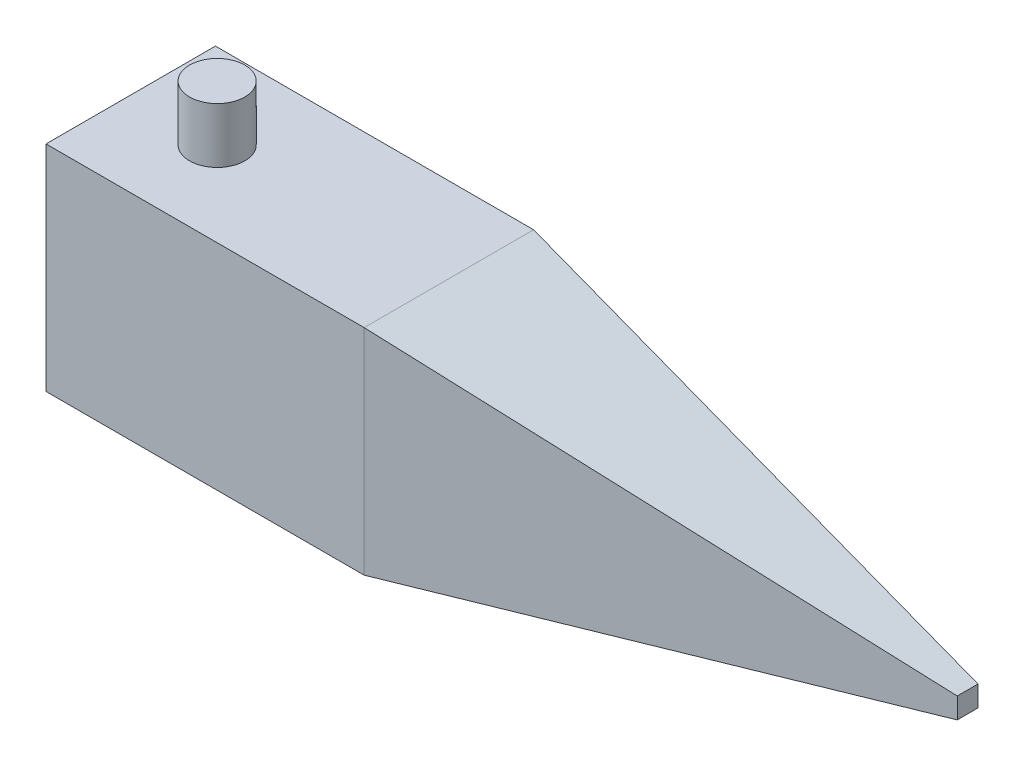
ISO-10303-21;
HEADER;
FILE_DESCRIPTION(('STEP AP214'),'2;1');
FILE_NAME('part.step','',(''),(''),'','','');
FILE_SCHEMA(('AUTOMOTIVE_DESIGN { 1 0 10303 214 1 1 1 1 }'));
ENDSEC;
DATA;
#1=APPLICATION_CONTEXT('core data for automotive mechanical design processes');
#2=APPLICATION_PROTOCOL_DEFINITION('international standard','automotive_design',2000,#1);
#3=PRODUCT_CONTEXT('',#1,'mechanical');
#4=PRODUCT('Part','Part','',(#3));
#5=PRODUCT_RELATED_PRODUCT_CATEGORY('part','',(#4));
#6=PRODUCT_DEFINITION_FORMATION('','',#4);
#7=PRODUCT_DEFINITION_CONTEXT('part definition',#1,'design');
#8=PRODUCT_DEFINITION('design','',#6,#7);
#9=PRODUCT_DEFINITION_SHAPE('','',#8);
#10=(LENGTH_UNIT() NAMED_UNIT(*) SI_UNIT(.MILLI.,.METRE.));
#11=(NAMED_UNIT(*) PLANE_ANGLE_UNIT() SI_UNIT($,.RADIAN.));
#12=(NAMED_UNIT(*) SI_UNIT($,.STERADIAN.) SOLID_ANGLE_UNIT());
#13=UNCERTAINTY_MEASURE_WITH_UNIT(LENGTH_MEASURE(1.E-05),#10,'distance_accuracy_value','');
#14=(GEOMETRIC_REPRESENTATION_CONTEXT(3) GLOBAL_UNCERTAINTY_ASSIGNED_CONTEXT((#13)) GLOBAL_UNIT_ASSIGNED_CONTEXT((#10,
#11,#12)) REPRESENTATION_CONTEXT('',''));
#15=CARTESIAN_POINT('',(0.,0.,0.));
#16=DIRECTION('',(0.,0.,1.));
#17=DIRECTION('',(1.,0.,0.));
#18=AXIS2_PLACEMENT_3D('',#15,#16,#17);
#19=CARTESIAN_POINT('',(0.,0.,0.));
#20=DIRECTION('',(0.,-1.,0.));
#21=DIRECTION('',(0.,0.,-1.));
#22=AXIS2_PLACEMENT_3D('',#19,#20,#21);
#23=PLANE('',#22);
#24=DIRECTION('',(0.,0.,1.));
#25=VECTOR('',#24,1.);
#26=CARTESIAN_POINT('',(23.,0.,0.));
#27=LINE('',#26,#25);
#28=CARTESIAN_POINT('',(23.,0.,12.25));
#29=VERTEX_POINT('',#28);
#30=CARTESIAN_POINT('',(22.9999999999999,0.,-12.25));
#31=VERTEX_POINT('',#30);
#32=EDGE_CURVE('E336',#29,#31,#27,.F.);
#33=ORIENTED_EDGE('',*,*,#32,.F.);
#34=DIRECTION('',(1.,0.,0.));
#35=VECTOR('',#34,1.);
#36=CARTESIAN_POINT('',(-23.,0.,12.25));
#37=LINE('',#36,#35);
#38=CARTESIAN_POINT('',(-23.,0.,12.25));
#39=VERTEX_POINT('',#38);
#40=EDGE_CURVE('E343',#39,#29,#37,.T.);
#41=ORIENTED_EDGE('',*,*,#40,.F.);
#42=DIRECTION('',(0.,0.,1.));
#43=VECTOR('',#42,1.);
#44=CARTESIAN_POINT('',(-23.,0.,12.25));
#45=LINE('',#44,#43);
#46=CARTESIAN_POINT('',(-23.,0.,-12.25));
#47=VERTEX_POINT('',#46);
#48=EDGE_CURVE('E341',#47,#39,#45,.T.);
#49=ORIENTED_EDGE('',*,*,#48,.F.);
#50=DIRECTION('',(-1.,0.,0.));
#51=VECTOR('',#50,1.);
#52=CARTESIAN_POINT('',(-23.,0.,-12.25));
#53=LINE('',#52,#51);
#54=EDGE_CURVE('E344',#31,#47,#53,.T.);
#55=ORIENTED_EDGE('',*,*,#54,.F.);
#56=EDGE_LOOP('',(#33,#41,#49,#55));
#57=FACE_BOUND('',#56,.T.);
#58=DIRECTION('',(1.,0.,0.));
#59=VECTOR('',#58,1.);
#60=CARTESIAN_POINT('',(-21.,0.,10.25));
#61=LINE('',#60,#59);
#62=CARTESIAN_POINT('',(-21.,0.,10.25));
#63=VERTEX_POINT('',#62);
#64=CARTESIAN_POINT('',(21.,0.,10.25));
#65=VERTEX_POINT('',#64);
#66=EDGE_CURVE('E308',#63,#65,#61,.T.);
#67=ORIENTED_EDGE('',*,*,#66,.T.);
#68=DIRECTION('',(0.,0.,-1.));
#69=VECTOR('',#68,1.);
#70=CARTESIAN_POINT('',(21.,0.,-10.25));
#71=LINE('',#70,#69);
#72=CARTESIAN_POINT('',(21.,0.,-10.25));
#73=VERTEX_POINT('',#72);
#74=EDGE_CURVE('E315',#65,#73,#71,.T.);
#75=ORIENTED_EDGE('',*,*,#74,.T.);
#76=DIRECTION('',(-1.,0.,0.));
#77=VECTOR('',#76,1.);
#78=CARTESIAN_POINT('',(-21.,0.,-10.25));
#79=LINE('',#78,#77);
#80=CARTESIAN_POINT('',(-21.,0.,-10.25));
#81=VERTEX_POINT('',#80);
#82=EDGE_CURVE('E318',#73,#81,#79,.T.);
#83=ORIENTED_EDGE('',*,*,#82,.T.);
#84=DIRECTION('',(0.,0.,1.));
#85=VECTOR('',#84,1.);
#86=CARTESIAN_POINT('',(-21.,0.,-10.25));
#87=LINE('',#86,#85);
#88=EDGE_CURVE('E322',#81,#63,#87,.T.);
#89=ORIENTED_EDGE('',*,*,#88,.T.);
#90=EDGE_LOOP('',(#67,#75,#83,#89));
#91=FACE_BOUND('',#90,.T.);
#92=ADVANCED_FACE('F43',(#57,#91),#23,.T.);
#93=CARTESIAN_POINT('',(-23.,31.,-12.25));
#94=DIRECTION('',(0.,0.,1.));
#95=DIRECTION('',(1.,0.,0.));
#96=AXIS2_PLACEMENT_3D('',#93,#94,#95);
#97=PLANE('',#96);
#98=ORIENTED_EDGE('',*,*,#54,.T.);
#99=DIRECTION('',(0.,-1.,0.));
#100=VECTOR('',#99,1.);
#101=CARTESIAN_POINT('',(-23.,31.,-12.25));
#102=LINE('',#101,#100);
#103=CARTESIAN_POINT('',(-23.,31.,-12.25));
#104=VERTEX_POINT('',#103);
#105=EDGE_CURVE('E348',#104,#47,#102,.T.);
#106=ORIENTED_EDGE('',*,*,#105,.F.);
#107=DIRECTION('',(-1.,0.,0.));
#108=VECTOR('',#107,1.);
#109=CARTESIAN_POINT('',(-23.,31.,-12.25));
#110=LINE('',#109,#108);
#111=CARTESIAN_POINT('',(22.9999999999999,31.,-12.25));
#112=VERTEX_POINT('',#111);
#113=EDGE_CURVE('E340',#112,#104,#110,.T.);
#114=ORIENTED_EDGE('',*,*,#113,.F.);
#115=DIRECTION('',(0.,1.,0.));
#116=VECTOR('',#115,1.);
#117=CARTESIAN_POINT('',(23.,31.,-12.25));
#118=LINE('',#117,#116);
#119=EDGE_CURVE('E352',#112,#31,#118,.F.);
#120=ORIENTED_EDGE('',*,*,#119,.T.);
#121=EDGE_LOOP('',(#98,#106,#114,#120));
#122=FACE_BOUND('',#121,.T.);
#123=ADVANCED_FACE('F45',(#122),#97,.F.);
#124=CARTESIAN_POINT('',(-23.,31.,12.25));
#125=DIRECTION('',(1.,0.,0.));
#126=DIRECTION('',(0.,0.,-1.));
#127=AXIS2_PLACEMENT_3D('',#124,#125,#126);
#128=PLANE('',#127);
#129=DIRECTION('',(0.,0.,1.));
#130=VECTOR('',#129,1.);
#131=CARTESIAN_POINT('',(-23.,22.,-4.50000000000001));
#132=LINE('',#131,#130);
#133=CARTESIAN_POINT('',(-23.,22.,-6.));
#134=VERTEX_POINT('',#133);
#135=CARTESIAN_POINT('',(-23.,22.,-4.50000000000001));
#136=VERTEX_POINT('',#135);
#137=EDGE_CURVE('E180',#134,#136,#132,.T.);
#138=ORIENTED_EDGE('',*,*,#137,.F.);
#139=DIRECTION('',(0.,-1.,0.));
#140=VECTOR('',#139,1.);
#141=CARTESIAN_POINT('',(-23.,22.,-6.00000000000001));
#142=LINE('',#141,#140);
#143=CARTESIAN_POINT('',(-23.,27.,-6.00000000000001));
#144=VERTEX_POINT('',#143);
#145=EDGE_CURVE('E58',#144,#134,#142,.T.);
#146=ORIENTED_EDGE('',*,*,#145,.F.);
#147=DIRECTION('',(0.,0.,-1.));
#148=VECTOR('',#147,1.);
#149=CARTESIAN_POINT('',(-23.,27.,-6.00000000000001));
#150=LINE('',#149,#148);
#151=CARTESIAN_POINT('',(-23.,27.,5.99999999999999));
#152=VERTEX_POINT('',#151);
#153=EDGE_CURVE('E202',#152,#144,#150,.T.);
#154=ORIENTED_EDGE('',*,*,#153,.F.);
#155=DIRECTION('',(0.,1.,0.));
#156=VECTOR('',#155,1.);
#157=CARTESIAN_POINT('',(-23.,27.,5.99999999999999));
#158=LINE('',#157,#156);
#159=CARTESIAN_POINT('',(-23.,22.,6.));
#160=VERTEX_POINT('',#159);
#161=EDGE_CURVE('E199',#160,#152,#158,.T.);
#162=ORIENTED_EDGE('',*,*,#161,.F.);
#163=DIRECTION('',(0.,0.,1.));
#164=VECTOR('',#163,1.);
#165=CARTESIAN_POINT('',(-23.,22.,6.));
#166=LINE('',#165,#164);
#167=CARTESIAN_POINT('',(-23.,22.,4.5));
#168=VERTEX_POINT('',#167);
#169=EDGE_CURVE('E196',#168,#160,#166,.T.);
#170=ORIENTED_EDGE('',*,*,#169,.F.);
#171=DIRECTION('',(0.,1.,0.));
#172=VECTOR('',#171,1.);
#173=CARTESIAN_POINT('',(-23.,22.,4.5));
#174=LINE('',#173,#172);
#175=CARTESIAN_POINT('',(-23.,2.,4.5));
#176=VERTEX_POINT('',#175);
#177=EDGE_CURVE('E190',#176,#168,#174,.T.);
#178=ORIENTED_EDGE('',*,*,#177,.F.);
#179=DIRECTION('',(0.,0.,1.));
#180=VECTOR('',#179,1.);
#181=CARTESIAN_POINT('',(-23.,2.,4.5));
#182=LINE('',#181,#180);
#183=CARTESIAN_POINT('',(-23.,2.,-4.50000000000001));
#184=VERTEX_POINT('',#183);
#185=EDGE_CURVE('E188',#184,#176,#182,.T.);
#186=ORIENTED_EDGE('',*,*,#185,.F.);
#187=DIRECTION('',(0.,-1.,0.));
#188=VECTOR('',#187,1.);
#189=CARTESIAN_POINT('',(-23.,2.,-4.50000000000001));
#190=LINE('',#189,#188);
#191=EDGE_CURVE('E171',#136,#184,#190,.T.);
#192=ORIENTED_EDGE('',*,*,#191,.F.);
#193=EDGE_LOOP('',(#138,#146,#154,#162,#170,#178,#186,#192));
#194=FACE_BOUND('',#193,.T.);
#195=ORIENTED_EDGE('',*,*,#48,.T.);
#196=DIRECTION('',(0.,-1.,0.));
#197=VECTOR('',#196,1.);
#198=CARTESIAN_POINT('',(-23.,31.,12.25));
#199=LINE('',#198,#197);
#200=CARTESIAN_POINT('',(-23.,31.,12.25));
#201=VERTEX_POINT('',#200);
#202=EDGE_CURVE('E345',#201,#39,#199,.T.);
#203=ORIENTED_EDGE('',*,*,#202,.F.);
#204=DIRECTION('',(0.,0.,1.));
#205=VECTOR('',#204,1.);
#206=CARTESIAN_POINT('',(-23.,31.,12.25));
#207=LINE('',#206,#205);
#208=EDGE_CURVE('E337',#104,#201,#207,.T.);
#209=ORIENTED_EDGE('',*,*,#208,.F.);
#210=ORIENTED_EDGE('',*,*,#105,.T.);
#211=EDGE_LOOP('',(#195,#203,#209,#210));
#212=FACE_BOUND('',#211,.T.);
#213=ADVANCED_FACE('F184',(#194,#212),#128,.F.);
#214=CARTESIAN_POINT('',(-23.,31.,12.25));
#215=DIRECTION('',(0.,0.,-1.));
#216=DIRECTION('',(-1.,0.,0.));
#217=AXIS2_PLACEMENT_3D('',#214,#215,#216);
#218=PLANE('',#217);
#219=ORIENTED_EDGE('',*,*,#40,.T.);
#220=DIRECTION('',(0.,1.,0.));
#221=VECTOR('',#220,1.);
#222=CARTESIAN_POINT('',(23.,0.,12.25));
#223=LINE('',#222,#221);
#224=CARTESIAN_POINT('',(23.,31.,12.25));
#225=VERTEX_POINT('',#224);
#226=EDGE_CURVE('E349',#225,#29,#223,.F.);
#227=ORIENTED_EDGE('',*,*,#226,.F.);
#228=DIRECTION('',(1.,0.,0.));
#229=VECTOR('',#228,1.);
#230=CARTESIAN_POINT('',(-23.,31.,12.25));
#231=LINE('',#230,#229);
#232=EDGE_CURVE('E339',#201,#225,#231,.T.);
#233=ORIENTED_EDGE('',*,*,#232,.F.);
#234=ORIENTED_EDGE('',*,*,#202,.T.);
#235=EDGE_LOOP('',(#219,#227,#233,#234));
#236=FACE_BOUND('',#235,.T.);
#237=ADVANCED_FACE('F418',(#236),#218,.F.);
#238=CARTESIAN_POINT('',(0.,31.,0.));
#239=DIRECTION('',(0.,-1.,0.));
#240=DIRECTION('',(0.,0.,-1.));
#241=AXIS2_PLACEMENT_3D('',#238,#239,#240);
#242=PLANE('',#241);
#243=CARTESIAN_POINT('',(-10.5,31.,0.));
#244=DIRECTION('',(0.,-1.,0.));
#245=DIRECTION('',(0.,0.,-1.));
#246=AXIS2_PLACEMENT_3D('',#243,#244,#245);
#247=CIRCLE('',#246,4.);
#248=CARTESIAN_POINT('',(-10.5,31.,-4.));
#249=VERTEX_POINT('',#248);
#250=EDGE_CURVE('E12',#249,#249,#247,.F.);
#251=ORIENTED_EDGE('',*,*,#250,.F.);
#252=EDGE_LOOP('',(#251));
#253=FACE_BOUND('',#252,.T.);
#254=DIRECTION('',(0.,0.,-1.));
#255=VECTOR('',#254,1.);
#256=CARTESIAN_POINT('',(23.,31.,0.));
#257=LINE('',#256,#255);
#258=EDGE_CURVE('E355',#225,#112,#257,.T.);
#259=ORIENTED_EDGE('',*,*,#258,.T.);
#260=ORIENTED_EDGE('',*,*,#113,.T.);
#261=ORIENTED_EDGE('',*,*,#208,.T.);
#262=ORIENTED_EDGE('',*,*,#232,.T.);
#263=EDGE_LOOP('',(#259,#260,#261,#262));
#264=FACE_BOUND('',#263,.T.);
#265=ADVANCED_FACE('F414',(#253,#264),#242,.F.);
#266=CARTESIAN_POINT('',(21.,29.,-10.25));
#267=DIRECTION('',(-1.,0.,0.));
#268=DIRECTION('',(0.,0.,1.));
#269=AXIS2_PLACEMENT_3D('',#266,#267,#268);
#270=PLANE('',#269);
#271=ORIENTED_EDGE('',*,*,#74,.F.);
#272=DIRECTION('',(0.,-1.,0.));
#273=VECTOR('',#272,1.);
#274=CARTESIAN_POINT('',(21.,29.,10.25));
#275=LINE('',#274,#273);
#276=CARTESIAN_POINT('',(21.,29.,10.25));
#277=VERTEX_POINT('',#276);
#278=EDGE_CURVE('E314',#277,#65,#275,.T.);
#279=ORIENTED_EDGE('',*,*,#278,.F.);
#280=DIRECTION('',(0.,0.,-1.));
#281=VECTOR('',#280,1.);
#282=CARTESIAN_POINT('',(21.,29.,-10.25));
#283=LINE('',#282,#281);
#284=CARTESIAN_POINT('',(21.,29.,-10.25));
#285=VERTEX_POINT('',#284);
#286=EDGE_CURVE('E299',#277,#285,#283,.T.);
#287=ORIENTED_EDGE('',*,*,#286,.T.);
#288=DIRECTION('',(0.,-1.,0.));
#289=VECTOR('',#288,1.);
#290=CARTESIAN_POINT('',(21.,29.,-10.25));
#291=LINE('',#290,#289);
#292=EDGE_CURVE('E333',#285,#73,#291,.T.);
#293=ORIENTED_EDGE('',*,*,#292,.T.);
#294=EDGE_LOOP('',(#271,#279,#287,#293));
#295=FACE_BOUND('',#294,.T.);
#296=ADVANCED_FACE('F417',(#295),#270,.T.);
#297=CARTESIAN_POINT('',(-21.,29.,-10.25));
#298=DIRECTION('',(0.,0.,1.));
#299=DIRECTION('',(1.,0.,0.));
#300=AXIS2_PLACEMENT_3D('',#297,#298,#299);
#301=PLANE('',#300);
#302=ORIENTED_EDGE('',*,*,#82,.F.);
#303=ORIENTED_EDGE('',*,*,#292,.F.);
#304=DIRECTION('',(-1.,0.,0.));
#305=VECTOR('',#304,1.);
#306=CARTESIAN_POINT('',(-21.,29.,-10.25));
#307=LINE('',#306,#305);
#308=CARTESIAN_POINT('',(-21.,29.,-10.25));
#309=VERTEX_POINT('',#308);
#310=EDGE_CURVE('E307',#285,#309,#307,.T.);
#311=ORIENTED_EDGE('',*,*,#310,.T.);
#312=DIRECTION('',(0.,-1.,0.));
#313=VECTOR('',#312,1.);
#314=CARTESIAN_POINT('',(-21.,29.,-10.25));
#315=LINE('',#314,#313);
#316=EDGE_CURVE('E331',#309,#81,#315,.T.);
#317=ORIENTED_EDGE('',*,*,#316,.T.);
#318=EDGE_LOOP('',(#302,#303,#311,#317));
#319=FACE_BOUND('',#318,.T.);
#320=ADVANCED_FACE('F464',(#319),#301,.T.);
#321=CARTESIAN_POINT('',(-21.,29.,-10.25));
#322=DIRECTION('',(1.,0.,0.));
#323=DIRECTION('',(0.,0.,-1.));
#324=AXIS2_PLACEMENT_3D('',#321,#322,#323);
#325=PLANE('',#324);
#326=DIRECTION('',(0.,1.,0.));
#327=VECTOR('',#326,1.);
#328=CARTESIAN_POINT('',(-21.,29.,-6.00000000000001));
#329=LINE('',#328,#327);
#330=CARTESIAN_POINT('',(-21.,22.,-6.00000000000001));
#331=VERTEX_POINT('',#330);
#332=CARTESIAN_POINT('',(-21.,27.,-6.00000000000001));
#333=VERTEX_POINT('',#332);
#334=EDGE_CURVE('E51',#331,#333,#329,.T.);
#335=ORIENTED_EDGE('',*,*,#334,.F.);
#336=DIRECTION('',(0.,0.,-1.));
#337=VECTOR('',#336,1.);
#338=CARTESIAN_POINT('',(-21.,22.,-10.25));
#339=LINE('',#338,#337);
#340=CARTESIAN_POINT('',(-21.,22.,-4.50000000000001));
#341=VERTEX_POINT('',#340);
#342=EDGE_CURVE('E367',#341,#331,#339,.T.);
#343=ORIENTED_EDGE('',*,*,#342,.F.);
#344=DIRECTION('',(0.,1.,0.));
#345=VECTOR('',#344,1.);
#346=CARTESIAN_POINT('',(-21.,29.,-4.50000000000001));
#347=LINE('',#346,#345);
#348=CARTESIAN_POINT('',(-21.,2.,-4.50000000000001));
#349=VERTEX_POINT('',#348);
#350=EDGE_CURVE('E174',#349,#341,#347,.T.);
#351=ORIENTED_EDGE('',*,*,#350,.F.);
#352=DIRECTION('',(0.,0.,-1.));
#353=VECTOR('',#352,1.);
#354=CARTESIAN_POINT('',(-21.,1.99999999999999,-10.25));
#355=LINE('',#354,#353);
#356=CARTESIAN_POINT('',(-21.,2.,4.5));
#357=VERTEX_POINT('',#356);
#358=EDGE_CURVE('E370',#357,#349,#355,.T.);
#359=ORIENTED_EDGE('',*,*,#358,.F.);
#360=DIRECTION('',(0.,-1.,0.));
#361=VECTOR('',#360,1.);
#362=CARTESIAN_POINT('',(-21.,29.,4.5));
#363=LINE('',#362,#361);
#364=CARTESIAN_POINT('',(-21.,22.,4.5));
#365=VERTEX_POINT('',#364);
#366=EDGE_CURVE('E372',#365,#357,#363,.T.);
#367=ORIENTED_EDGE('',*,*,#366,.F.);
#368=DIRECTION('',(0.,0.,-1.));
#369=VECTOR('',#368,1.);
#370=CARTESIAN_POINT('',(-21.,22.,-10.25));
#371=LINE('',#370,#369);
#372=CARTESIAN_POINT('',(-21.,22.,6.));
#373=VERTEX_POINT('',#372);
#374=EDGE_CURVE('E374',#373,#365,#371,.T.);
#375=ORIENTED_EDGE('',*,*,#374,.F.);
#376=DIRECTION('',(0.,-1.,0.));
#377=VECTOR('',#376,1.);
#378=CARTESIAN_POINT('',(-21.,29.,5.99999999999999));
#379=LINE('',#378,#377);
#380=CARTESIAN_POINT('',(-21.,27.,5.99999999999999));
#381=VERTEX_POINT('',#380);
#382=EDGE_CURVE('E376',#381,#373,#379,.T.);
#383=ORIENTED_EDGE('',*,*,#382,.F.);
#384=DIRECTION('',(0.,0.,1.));
#385=VECTOR('',#384,1.);
#386=CARTESIAN_POINT('',(-21.,27.,-10.25));
#387=LINE('',#386,#385);
#388=EDGE_CURVE('E378',#333,#381,#387,.T.);
#389=ORIENTED_EDGE('',*,*,#388,.F.);
#390=EDGE_LOOP('',(#335,#343,#351,#359,#367,#375,#383,#389));
#391=FACE_BOUND('',#390,.T.);
#392=ORIENTED_EDGE('',*,*,#88,.F.);
#393=ORIENTED_EDGE('',*,*,#316,.F.);
#394=DIRECTION('',(0.,0.,1.));
#395=VECTOR('',#394,1.);
#396=CARTESIAN_POINT('',(-21.,29.,-10.25));
#397=LINE('',#396,#395);
#398=CARTESIAN_POINT('',(-21.,29.,10.25));
#399=VERTEX_POINT('',#398);
#400=EDGE_CURVE('E310',#309,#399,#397,.T.);
#401=ORIENTED_EDGE('',*,*,#400,.T.);
#402=DIRECTION('',(0.,-1.,0.));
#403=VECTOR('',#402,1.);
#404=CARTESIAN_POINT('',(-21.,29.,10.25));
#405=LINE('',#404,#403);
#406=EDGE_CURVE('E329',#399,#63,#405,.T.);
#407=ORIENTED_EDGE('',*,*,#406,.T.);
#408=EDGE_LOOP('',(#392,#393,#401,#407));
#409=FACE_BOUND('',#408,.T.);
#410=ADVANCED_FACE('F389',(#391,#409),#325,.T.);
#411=CARTESIAN_POINT('',(-21.,29.,10.25));
#412=DIRECTION('',(0.,0.,-1.));
#413=DIRECTION('',(-1.,0.,0.));
#414=AXIS2_PLACEMENT_3D('',#411,#412,#413);
#415=PLANE('',#414);
#416=ORIENTED_EDGE('',*,*,#66,.F.);
#417=ORIENTED_EDGE('',*,*,#406,.F.);
#418=DIRECTION('',(1.,0.,0.));
#419=VECTOR('',#418,1.);
#420=CARTESIAN_POINT('',(-21.,29.,10.25));
#421=LINE('',#420,#419);
#422=EDGE_CURVE('E312',#399,#277,#421,.T.);
#423=ORIENTED_EDGE('',*,*,#422,.T.);
#424=ORIENTED_EDGE('',*,*,#278,.T.);
#425=EDGE_LOOP('',(#416,#417,#423,#424));
#426=FACE_BOUND('',#425,.T.);
#427=ADVANCED_FACE('F457',(#426),#415,.T.);
#428=CARTESIAN_POINT('',(0.,29.,0.));
#429=DIRECTION('',(0.,1.,0.));
#430=DIRECTION('',(0.,0.,1.));
#431=AXIS2_PLACEMENT_3D('',#428,#429,#430);
#432=PLANE('',#431);
#433=ORIENTED_EDGE('',*,*,#286,.F.);
#434=ORIENTED_EDGE('',*,*,#422,.F.);
#435=ORIENTED_EDGE('',*,*,#400,.F.);
#436=ORIENTED_EDGE('',*,*,#310,.F.);
#437=EDGE_LOOP('',(#433,#434,#435,#436));
#438=FACE_BOUND('',#437,.T.);
#439=ADVANCED_FACE('F454',(#438),#432,.F.);
#440=CARTESIAN_POINT('',(98.,0.,0.));
#441=DIRECTION('',(-1.,0.,0.));
#442=DIRECTION('',(0.,0.,1.));
#443=AXIS2_PLACEMENT_3D('',#440,#441,#442);
#444=PLANE('',#443);
#445=DIRECTION('',(0.,1.,0.));
#446=VECTOR('',#445,1.);
#447=CARTESIAN_POINT('',(98.,14.,-1.5));
#448=LINE('',#447,#446);
#449=CARTESIAN_POINT('',(98.,14.,-1.5));
#450=VERTEX_POINT('',#449);
#451=CARTESIAN_POINT('',(98.,17.,-1.5));
#452=VERTEX_POINT('',#451);
#453=EDGE_CURVE('E207',#450,#452,#448,.T.);
#454=ORIENTED_EDGE('',*,*,#453,.T.);
#455=DIRECTION('',(0.,0.,1.));
#456=VECTOR('',#455,1.);
#457=CARTESIAN_POINT('',(98.,17.,1.5));
#458=LINE('',#457,#456);
#459=CARTESIAN_POINT('',(98.,17.,1.5));
#460=VERTEX_POINT('',#459);
#461=EDGE_CURVE('E286',#452,#460,#458,.T.);
#462=ORIENTED_EDGE('',*,*,#461,.T.);
#463=DIRECTION('',(0.,-1.,0.));
#464=VECTOR('',#463,1.);
#465=CARTESIAN_POINT('',(98.,14.,1.5));
#466=LINE('',#465,#464);
#467=CARTESIAN_POINT('',(98.,14.,1.5));
#468=VERTEX_POINT('',#467);
#469=EDGE_CURVE('E271',#460,#468,#466,.T.);
#470=ORIENTED_EDGE('',*,*,#469,.T.);
#471=DIRECTION('',(0.,0.,-1.));
#472=VECTOR('',#471,1.);
#473=CARTESIAN_POINT('',(98.,14.,1.5));
#474=LINE('',#473,#472);
#475=EDGE_CURVE('E223',#468,#450,#474,.T.);
#476=ORIENTED_EDGE('',*,*,#475,.T.);
#477=EDGE_LOOP('',(#454,#462,#470,#476));
#478=FACE_BOUND('',#477,.T.);
#479=ADVANCED_FACE('F242',(#478),#444,.F.);
#480=CARTESIAN_POINT('',(0.774437381893146,-4.14877168871328,0.));
#481=DIRECTION('',(0.183497113102886,-0.98302024876546,0.));
#482=DIRECTION('',(0.98302024876546,0.183497113102886,0.));
#483=AXIS2_PLACEMENT_3D('',#480,#481,#482);
#484=PLANE('',#483);
#485=DIRECTION('',(-0.973405377611249,-0.1817023371541,0.139521437457612));
#486=VECTOR('',#485,1.);
#487=CARTESIAN_POINT('',(98.,14.,1.5));
#488=LINE('',#487,#486);
#489=EDGE_CURVE('E229',#468,#29,#488,.T.);
#490=ORIENTED_EDGE('',*,*,#489,.T.);
#491=ORIENTED_EDGE('',*,*,#32,.T.);
#492=DIRECTION('',(-0.973405377611249,-0.1817023371541,-0.139521437457612));
#493=VECTOR('',#492,1.);
#494=CARTESIAN_POINT('',(98.,14.,-1.5));
#495=LINE('',#494,#493);
#496=EDGE_CURVE('E433',#450,#31,#495,.T.);
#497=ORIENTED_EDGE('',*,*,#496,.F.);
#498=ORIENTED_EDGE('',*,*,#475,.F.);
#499=EDGE_LOOP('',(#490,#491,#497,#498));
#500=FACE_BOUND('',#499,.T.);
#501=ADVANCED_FACE('F231',(#500),#484,.T.);
#502=CARTESIAN_POINT('',(2.18349682631275,0.,-15.2336987882285));
#503=DIRECTION('',(-0.141883286423856,0.,0.989883393654811));
#504=DIRECTION('',(0.989883393654811,0.,0.141883286423856));
#505=AXIS2_PLACEMENT_3D('',#502,#503,#504);
#506=PLANE('',#505);
#507=ORIENTED_EDGE('',*,*,#496,.T.);
#508=ORIENTED_EDGE('',*,*,#119,.F.);
#509=DIRECTION('',(-0.973405377611249,0.1817023371541,-0.139521437457612));
#510=VECTOR('',#509,1.);
#511=CARTESIAN_POINT('',(98.,17.,-1.5));
#512=LINE('',#511,#510);
#513=EDGE_CURVE('E319',#452,#112,#512,.T.);
#514=ORIENTED_EDGE('',*,*,#513,.F.);
#515=ORIENTED_EDGE('',*,*,#453,.F.);
#516=EDGE_LOOP('',(#507,#508,#514,#515));
#517=FACE_BOUND('',#516,.T.);
#518=ADVANCED_FACE('F241',(#517),#506,.F.);
#519=CARTESIAN_POINT('',(2.18349682631275,0.,15.2336987882285));
#520=DIRECTION('',(0.141883286423856,0.,0.989883393654811));
#521=DIRECTION('',(0.989883393654811,0.,-0.141883286423856));
#522=AXIS2_PLACEMENT_3D('',#519,#520,#521);
#523=PLANE('',#522);
#524=DIRECTION('',(-0.973405377611249,0.1817023371541,0.139521437457612));
#525=VECTOR('',#524,1.);
#526=CARTESIAN_POINT('',(98.,17.,1.5));
#527=LINE('',#526,#525);
#528=EDGE_CURVE('E429',#460,#225,#527,.T.);
#529=ORIENTED_EDGE('',*,*,#528,.T.);
#530=ORIENTED_EDGE('',*,*,#226,.T.);
#531=ORIENTED_EDGE('',*,*,#489,.F.);
#532=ORIENTED_EDGE('',*,*,#469,.F.);
#533=EDGE_LOOP('',(#529,#530,#531,#532));
#534=FACE_BOUND('',#533,.T.);
#535=ADVANCED_FACE('F248',(#534),#523,.T.);
#536=CARTESIAN_POINT('',(6.36626009276757,34.1049647826834,0.));
#537=DIRECTION('',(-0.183497113102886,-0.98302024876546,0.));
#538=DIRECTION('',(0.98302024876546,-0.183497113102886,0.));
#539=AXIS2_PLACEMENT_3D('',#536,#537,#538);
#540=PLANE('',#539);
#541=ORIENTED_EDGE('',*,*,#513,.T.);
#542=ORIENTED_EDGE('',*,*,#258,.F.);
#543=ORIENTED_EDGE('',*,*,#528,.F.);
#544=ORIENTED_EDGE('',*,*,#461,.F.);
#545=EDGE_LOOP('',(#541,#542,#543,#544));
#546=FACE_BOUND('',#545,.T.);
#547=ADVANCED_FACE('F428',(#546),#540,.F.);
#548=CARTESIAN_POINT('',(6.,22.,-6.00000000000001));
#549=DIRECTION('',(0.,0.,-1.));
#550=DIRECTION('',(-1.,0.,0.));
#551=AXIS2_PLACEMENT_3D('',#548,#549,#550);
#552=PLANE('',#551);
#553=ORIENTED_EDGE('',*,*,#334,.T.);
#554=DIRECTION('',(-1.,0.,0.));
#555=VECTOR('',#554,1.);
#556=CARTESIAN_POINT('',(6.,27.,-6.00000000000001));
#557=LINE('',#556,#555);
#558=EDGE_CURVE('E205',#333,#144,#557,.T.);
#559=ORIENTED_EDGE('',*,*,#558,.T.);
#560=ORIENTED_EDGE('',*,*,#145,.T.);
#561=DIRECTION('',(-1.,0.,0.));
#562=VECTOR('',#561,1.);
#563=CARTESIAN_POINT('',(6.,22.,-6.00000000000001));
#564=LINE('',#563,#562);
#565=EDGE_CURVE('E177',#331,#134,#564,.T.);
#566=ORIENTED_EDGE('',*,*,#565,.F.);
#567=EDGE_LOOP('',(#553,#559,#560,#566));
#568=FACE_BOUND('',#567,.T.);
#569=ADVANCED_FACE('F381',(#568),#552,.F.);
#570=CARTESIAN_POINT('',(6.,27.,-6.00000000000001));
#571=DIRECTION('',(0.,1.,0.));
#572=DIRECTION('',(0.,0.,1.));
#573=AXIS2_PLACEMENT_3D('',#570,#571,#572);
#574=PLANE('',#573);
#575=ORIENTED_EDGE('',*,*,#388,.T.);
#576=DIRECTION('',(-1.,0.,0.));
#577=VECTOR('',#576,1.);
#578=CARTESIAN_POINT('',(6.,27.,5.99999999999999));
#579=LINE('',#578,#577);
#580=EDGE_CURVE('E208',#381,#152,#579,.T.);
#581=ORIENTED_EDGE('',*,*,#580,.T.);
#582=ORIENTED_EDGE('',*,*,#153,.T.);
#583=ORIENTED_EDGE('',*,*,#558,.F.);
#584=EDGE_LOOP('',(#575,#581,#582,#583));
#585=FACE_BOUND('',#584,.T.);
#586=ADVANCED_FACE('F385',(#585),#574,.F.);
#587=CARTESIAN_POINT('',(6.,27.,5.99999999999999));
#588=DIRECTION('',(0.,0.,1.));
#589=DIRECTION('',(0.,-1.,0.));
#590=AXIS2_PLACEMENT_3D('',#587,#588,#589);
#591=PLANE('',#590);
#592=ORIENTED_EDGE('',*,*,#382,.T.);
#593=DIRECTION('',(-1.,0.,0.));
#594=VECTOR('',#593,1.);
#595=CARTESIAN_POINT('',(6.,22.,6.));
#596=LINE('',#595,#594);
#597=EDGE_CURVE('E210',#373,#160,#596,.T.);
#598=ORIENTED_EDGE('',*,*,#597,.T.);
#599=ORIENTED_EDGE('',*,*,#161,.T.);
#600=ORIENTED_EDGE('',*,*,#580,.F.);
#601=EDGE_LOOP('',(#592,#598,#599,#600));
#602=FACE_BOUND('',#601,.T.);
#603=ADVANCED_FACE('F395',(#602),#591,.F.);
#604=CARTESIAN_POINT('',(6.,22.,6.));
#605=DIRECTION('',(0.,-1.,0.));
#606=DIRECTION('',(0.,0.,-1.));
#607=AXIS2_PLACEMENT_3D('',#604,#605,#606);
#608=PLANE('',#607);
#609=ORIENTED_EDGE('',*,*,#374,.T.);
#610=DIRECTION('',(-1.,0.,0.));
#611=VECTOR('',#610,1.);
#612=CARTESIAN_POINT('',(6.,22.,4.5));
#613=LINE('',#612,#611);
#614=EDGE_CURVE('E212',#365,#168,#613,.T.);
#615=ORIENTED_EDGE('',*,*,#614,.T.);
#616=ORIENTED_EDGE('',*,*,#169,.T.);
#617=ORIENTED_EDGE('',*,*,#597,.F.);
#618=EDGE_LOOP('',(#609,#615,#616,#617));
#619=FACE_BOUND('',#618,.T.);
#620=ADVANCED_FACE('F397',(#619),#608,.F.);
#621=CARTESIAN_POINT('',(6.,22.,4.5));
#622=DIRECTION('',(0.,0.,1.));
#623=DIRECTION('',(0.,-1.,0.));
#624=AXIS2_PLACEMENT_3D('',#621,#622,#623);
#625=PLANE('',#624);
#626=ORIENTED_EDGE('',*,*,#366,.T.);
#627=DIRECTION('',(-1.,0.,0.));
#628=VECTOR('',#627,1.);
#629=CARTESIAN_POINT('',(6.,2.,4.5));
#630=LINE('',#629,#628);
#631=EDGE_CURVE('E214',#357,#176,#630,.T.);
#632=ORIENTED_EDGE('',*,*,#631,.T.);
#633=ORIENTED_EDGE('',*,*,#177,.T.);
#634=ORIENTED_EDGE('',*,*,#614,.F.);
#635=EDGE_LOOP('',(#626,#632,#633,#634));
#636=FACE_BOUND('',#635,.T.);
#637=ADVANCED_FACE('F545',(#636),#625,.F.);
#638=CARTESIAN_POINT('',(6.,2.,4.5));
#639=DIRECTION('',(0.,-1.,0.));
#640=DIRECTION('',(0.,0.,-1.));
#641=AXIS2_PLACEMENT_3D('',#638,#639,#640);
#642=PLANE('',#641);
#643=ORIENTED_EDGE('',*,*,#358,.T.);
#644=DIRECTION('',(-1.,0.,0.));
#645=VECTOR('',#644,1.);
#646=CARTESIAN_POINT('',(6.,2.,-4.50000000000001));
#647=LINE('',#646,#645);
#648=EDGE_CURVE('E176',#349,#184,#647,.T.);
#649=ORIENTED_EDGE('',*,*,#648,.T.);
#650=ORIENTED_EDGE('',*,*,#185,.T.);
#651=ORIENTED_EDGE('',*,*,#631,.F.);
#652=EDGE_LOOP('',(#643,#649,#650,#651));
#653=FACE_BOUND('',#652,.T.);
#654=ADVANCED_FACE('F552',(#653),#642,.F.);
#655=CARTESIAN_POINT('',(6.,2.,-4.50000000000001));
#656=DIRECTION('',(0.,0.,-1.));
#657=DIRECTION('',(-1.,0.,0.));
#658=AXIS2_PLACEMENT_3D('',#655,#656,#657);
#659=PLANE('',#658);
#660=ORIENTED_EDGE('',*,*,#350,.T.);
#661=DIRECTION('',(-1.,0.,0.));
#662=VECTOR('',#661,1.);
#663=CARTESIAN_POINT('',(6.,22.,-4.50000000000001));
#664=LINE('',#663,#662);
#665=EDGE_CURVE('E66',#341,#136,#664,.T.);
#666=ORIENTED_EDGE('',*,*,#665,.T.);
#667=ORIENTED_EDGE('',*,*,#191,.T.);
#668=ORIENTED_EDGE('',*,*,#648,.F.);
#669=EDGE_LOOP('',(#660,#666,#667,#668));
#670=FACE_BOUND('',#669,.T.);
#671=ADVANCED_FACE('F168',(#670),#659,.F.);
#672=CARTESIAN_POINT('',(6.,22.,-4.50000000000001));
#673=DIRECTION('',(0.,-1.,0.));
#674=DIRECTION('',(0.,0.,-1.));
#675=AXIS2_PLACEMENT_3D('',#672,#673,#674);
#676=PLANE('',#675);
#677=ORIENTED_EDGE('',*,*,#342,.T.);
#678=ORIENTED_EDGE('',*,*,#565,.T.);
#679=ORIENTED_EDGE('',*,*,#137,.T.);
#680=ORIENTED_EDGE('',*,*,#665,.F.);
#681=EDGE_LOOP('',(#677,#678,#679,#680));
#682=FACE_BOUND('',#681,.T.);
#683=ADVANCED_FACE('F181',(#682),#676,.F.);
#684=CARTESIAN_POINT('',(-10.5,39.,0.));
#685=DIRECTION('',(0.,-1.,0.));
#686=DIRECTION('',(0.,0.,-1.));
#687=AXIS2_PLACEMENT_3D('',#684,#685,#686);
#688=CYLINDRICAL_SURFACE('',#687,4.);
#689=CARTESIAN_POINT('',(-10.5,39.,0.));
#690=DIRECTION('',(0.,1.,0.));
#691=DIRECTION('',(0.,0.,1.));
#692=AXIS2_PLACEMENT_3D('',#689,#690,#691);
#693=CIRCLE('',#692,4.);
#694=CARTESIAN_POINT('',(-10.5,39.,4.));
#695=VERTEX_POINT('',#694);
#696=EDGE_CURVE('E401',#695,#695,#693,.T.);
#697=ORIENTED_EDGE('',*,*,#696,.F.);
#698=EDGE_LOOP('',(#697));
#699=FACE_BOUND('',#698,.T.);
#700=ORIENTED_EDGE('',*,*,#250,.T.);
#701=EDGE_LOOP('',(#700));
#702=FACE_BOUND('',#701,.T.);
#703=ADVANCED_FACE('F408',(#699,#702),#688,.T.);
#704=CARTESIAN_POINT('',(-10.5,39.,0.));
#705=DIRECTION('',(0.,1.,0.));
#706=DIRECTION('',(0.,0.,1.));
#707=AXIS2_PLACEMENT_3D('',#704,#705,#706);
#708=PLANE('',#707);
#709=ORIENTED_EDGE('',*,*,#696,.T.);
#710=EDGE_LOOP('',(#709));
#711=FACE_BOUND('',#710,.T.);
#712=ADVANCED_FACE('F406',(#711),#708,.T.);
#713=CLOSED_SHELL('',(#92,#123,#213,#237,#265,#296,#320,#410,#427,#439,#479,#501,#518,#535,#547,
#569,#586,#603,#620,#637,#654,#671,#683,#703,#712));
#714=MANIFOLD_SOLID_BREP('B2',#713);
#715=ADVANCED_BREP_SHAPE_REPRESENTATION('',(#18,#714),#14);
#716=SHAPE_DEFINITION_REPRESENTATION(#9,#715);
ENDSEC;
END-ISO-10303-21;
